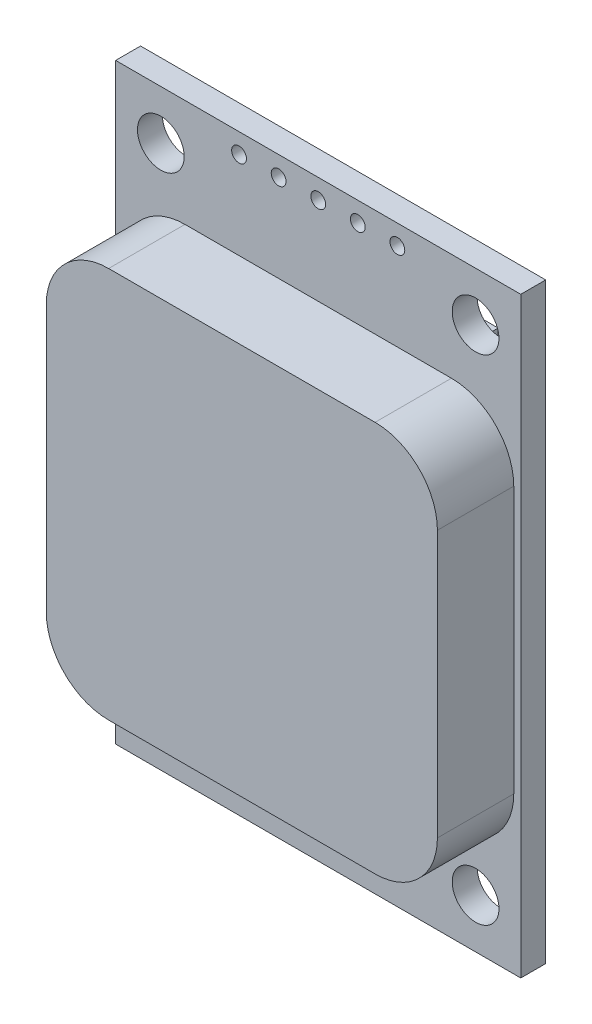
ISO-10303-21;
HEADER;
FILE_DESCRIPTION(('STEP AP214'),'2;1');
FILE_NAME('part.step','',(''),(''),'','','');
FILE_SCHEMA(('AUTOMOTIVE_DESIGN { 1 0 10303 214 1 1 1 1 }'));
ENDSEC;
DATA;
#1=APPLICATION_CONTEXT('core data for automotive mechanical design processes');
#2=APPLICATION_PROTOCOL_DEFINITION('international standard','automotive_design',2000,#1);
#3=PRODUCT_CONTEXT('',#1,'mechanical');
#4=PRODUCT('Part','Part','',(#3));
#5=PRODUCT_RELATED_PRODUCT_CATEGORY('part','',(#4));
#6=PRODUCT_DEFINITION_FORMATION('','',#4);
#7=PRODUCT_DEFINITION_CONTEXT('part definition',#1,'design');
#8=PRODUCT_DEFINITION('design','',#6,#7);
#9=PRODUCT_DEFINITION_SHAPE('','',#8);
#10=(LENGTH_UNIT() NAMED_UNIT(*) SI_UNIT(.MILLI.,.METRE.));
#11=(NAMED_UNIT(*) PLANE_ANGLE_UNIT() SI_UNIT($,.RADIAN.));
#12=(NAMED_UNIT(*) SI_UNIT($,.STERADIAN.) SOLID_ANGLE_UNIT());
#13=UNCERTAINTY_MEASURE_WITH_UNIT(LENGTH_MEASURE(1.E-05),#10,'distance_accuracy_value','');
#14=(GEOMETRIC_REPRESENTATION_CONTEXT(3) GLOBAL_UNCERTAINTY_ASSIGNED_CONTEXT((#13)) GLOBAL_UNIT_ASSIGNED_CONTEXT((#10,
#11,#12)) REPRESENTATION_CONTEXT('',''));
#15=CARTESIAN_POINT('',(0.,0.,0.));
#16=DIRECTION('',(0.,0.,1.));
#17=DIRECTION('',(1.,0.,0.));
#18=AXIS2_PLACEMENT_3D('',#15,#16,#17);
#19=CARTESIAN_POINT('',(0.,0.,-1.6));
#20=DIRECTION('',(0.,0.,1.));
#21=DIRECTION('',(1.,0.,0.));
#22=AXIS2_PLACEMENT_3D('',#19,#20,#21);
#23=PLANE('',#22);
#24=CARTESIAN_POINT('',(-5.08,17.73,-1.6));
#25=DIRECTION('',(0.,0.,-1.));
#26=DIRECTION('',(-1.,0.,0.));
#27=AXIS2_PLACEMENT_3D('',#24,#25,#26);
#28=CIRCLE('',#27,0.475);
#29=CARTESIAN_POINT('',(-5.555,17.73,-1.6));
#30=VERTEX_POINT('',#29);
#31=EDGE_CURVE('E454',#30,#30,#28,.T.);
#32=ORIENTED_EDGE('',*,*,#31,.F.);
#33=EDGE_LOOP('',(#32));
#34=FACE_BOUND('',#33,.T.);
#35=CARTESIAN_POINT('',(2.54,17.73,-1.6));
#36=DIRECTION('',(0.,0.,-1.));
#37=DIRECTION('',(-1.,0.,0.));
#38=AXIS2_PLACEMENT_3D('',#35,#36,#37);
#39=CIRCLE('',#38,0.475);
#40=CARTESIAN_POINT('',(2.065,17.73,-1.6));
#41=VERTEX_POINT('',#40);
#42=EDGE_CURVE('E455',#41,#41,#39,.T.);
#43=ORIENTED_EDGE('',*,*,#42,.F.);
#44=EDGE_LOOP('',(#43));
#45=FACE_BOUND('',#44,.T.);
#46=CARTESIAN_POINT('',(5.08,17.73,-1.6));
#47=DIRECTION('',(0.,0.,-1.));
#48=DIRECTION('',(-1.,0.,0.));
#49=AXIS2_PLACEMENT_3D('',#46,#47,#48);
#50=CIRCLE('',#49,0.475);
#51=CARTESIAN_POINT('',(4.605,17.73,-1.6));
#52=VERTEX_POINT('',#51);
#53=EDGE_CURVE('E462',#52,#52,#50,.T.);
#54=ORIENTED_EDGE('',*,*,#53,.F.);
#55=EDGE_LOOP('',(#54));
#56=FACE_BOUND('',#55,.T.);
#57=CARTESIAN_POINT('',(-2.54,17.73,-1.6));
#58=DIRECTION('',(0.,0.,-1.));
#59=DIRECTION('',(-1.,0.,0.));
#60=AXIS2_PLACEMENT_3D('',#57,#58,#59);
#61=CIRCLE('',#60,0.475);
#62=CARTESIAN_POINT('',(-3.015,17.73,-1.6));
#63=VERTEX_POINT('',#62);
#64=EDGE_CURVE('E447',#63,#63,#61,.T.);
#65=ORIENTED_EDGE('',*,*,#64,.F.);
#66=EDGE_LOOP('',(#65));
#67=FACE_BOUND('',#66,.T.);
#68=CARTESIAN_POINT('',(0.,17.73,-1.6));
#69=DIRECTION('',(0.,0.,-1.));
#70=DIRECTION('',(-1.,0.,0.));
#71=AXIS2_PLACEMENT_3D('',#68,#69,#70);
#72=CIRCLE('',#71,0.475);
#73=CARTESIAN_POINT('',(-0.475000000000002,17.73,-1.6));
#74=VERTEX_POINT('',#73);
#75=EDGE_CURVE('E428',#74,#74,#72,.T.);
#76=ORIENTED_EDGE('',*,*,#75,.F.);
#77=EDGE_LOOP('',(#76));
#78=FACE_BOUND('',#77,.T.);
#79=DIRECTION('',(0.,-1.,0.));
#80=VECTOR('',#79,1.);
#81=CARTESIAN_POINT('',(7.55,12.4,-1.6));
#82=LINE('',#81,#80);
#83=CARTESIAN_POINT('',(7.55,12.4,-1.6));
#84=VERTEX_POINT('',#83);
#85=CARTESIAN_POINT('',(7.55,0.700000000000004,-1.6));
#86=VERTEX_POINT('',#85);
#87=EDGE_CURVE('E194',#84,#86,#82,.T.);
#88=ORIENTED_EDGE('',*,*,#87,.F.);
#89=DIRECTION('',(1.,0.,0.));
#90=VECTOR('',#89,1.);
#91=CARTESIAN_POINT('',(7.55,12.4,-1.6));
#92=LINE('',#91,#90);
#93=CARTESIAN_POINT('',(-7.55,12.4,-1.6));
#94=VERTEX_POINT('',#93);
#95=EDGE_CURVE('E206',#94,#84,#92,.T.);
#96=ORIENTED_EDGE('',*,*,#95,.F.);
#97=DIRECTION('',(0.,1.,0.));
#98=VECTOR('',#97,1.);
#99=CARTESIAN_POINT('',(-7.55,12.4,-1.6));
#100=LINE('',#99,#98);
#101=CARTESIAN_POINT('',(-7.55,0.700000000000006,-1.6));
#102=VERTEX_POINT('',#101);
#103=EDGE_CURVE('E214',#102,#94,#100,.T.);
#104=ORIENTED_EDGE('',*,*,#103,.F.);
#105=DIRECTION('',(-1.,0.,0.));
#106=VECTOR('',#105,1.);
#107=CARTESIAN_POINT('',(7.55,0.700000000000004,-1.6));
#108=LINE('',#107,#106);
#109=EDGE_CURVE('E59',#86,#102,#108,.T.);
#110=ORIENTED_EDGE('',*,*,#109,.F.);
#111=EDGE_LOOP('',(#88,#96,#104,#110));
#112=FACE_BOUND('',#111,.T.);
#113=CARTESIAN_POINT('',(-10.1,-15.85,-1.6));
#114=DIRECTION('',(0.,0.,1.));
#115=DIRECTION('',(1.,0.,0.));
#116=AXIS2_PLACEMENT_3D('',#113,#114,#115);
#117=CIRCLE('',#116,1.5);
#118=CARTESIAN_POINT('',(-8.59999999999999,-15.85,-1.6));
#119=VERTEX_POINT('',#118);
#120=EDGE_CURVE('E265',#119,#119,#117,.F.);
#121=ORIENTED_EDGE('',*,*,#120,.F.);
#122=EDGE_LOOP('',(#121));
#123=FACE_BOUND('',#122,.T.);
#124=CARTESIAN_POINT('',(10.1,-15.85,-1.6));
#125=DIRECTION('',(0.,0.,1.));
#126=DIRECTION('',(1.,0.,0.));
#127=AXIS2_PLACEMENT_3D('',#124,#125,#126);
#128=CIRCLE('',#127,1.5);
#129=CARTESIAN_POINT('',(11.6,-15.85,-1.6));
#130=VERTEX_POINT('',#129);
#131=EDGE_CURVE('E258',#130,#130,#128,.F.);
#132=ORIENTED_EDGE('',*,*,#131,.F.);
#133=EDGE_LOOP('',(#132));
#134=FACE_BOUND('',#133,.T.);
#135=CARTESIAN_POINT('',(10.1,15.85,-1.6));
#136=DIRECTION('',(0.,0.,1.));
#137=DIRECTION('',(1.,0.,0.));
#138=AXIS2_PLACEMENT_3D('',#135,#136,#137);
#139=CIRCLE('',#138,1.5);
#140=CARTESIAN_POINT('',(11.6,15.85,-1.6));
#141=VERTEX_POINT('',#140);
#142=EDGE_CURVE('E257',#141,#141,#139,.F.);
#143=ORIENTED_EDGE('',*,*,#142,.F.);
#144=EDGE_LOOP('',(#143));
#145=FACE_BOUND('',#144,.T.);
#146=CARTESIAN_POINT('',(-10.1,15.85,-1.6));
#147=DIRECTION('',(0.,0.,1.));
#148=DIRECTION('',(1.,0.,0.));
#149=AXIS2_PLACEMENT_3D('',#146,#147,#148);
#150=CIRCLE('',#149,1.5);
#151=CARTESIAN_POINT('',(-8.59999999999999,15.85,-1.6));
#152=VERTEX_POINT('',#151);
#153=EDGE_CURVE('E274',#152,#152,#150,.F.);
#154=ORIENTED_EDGE('',*,*,#153,.F.);
#155=EDGE_LOOP('',(#154));
#156=FACE_BOUND('',#155,.T.);
#157=DIRECTION('',(0.,-1.,0.));
#158=VECTOR('',#157,1.);
#159=CARTESIAN_POINT('',(3.95000000000001,-13.3,-1.6));
#160=LINE('',#159,#158);
#161=CARTESIAN_POINT('',(3.95000000000001,-13.3,-1.6));
#162=VERTEX_POINT('',#161);
#163=CARTESIAN_POINT('',(3.95,-19.,-1.6));
#164=VERTEX_POINT('',#163);
#165=EDGE_CURVE('E51',#162,#164,#160,.T.);
#166=ORIENTED_EDGE('',*,*,#165,.F.);
#167=DIRECTION('',(1.,0.,0.));
#168=VECTOR('',#167,1.);
#169=CARTESIAN_POINT('',(3.95000000000001,-13.3,-1.6));
#170=LINE('',#169,#168);
#171=CARTESIAN_POINT('',(-3.94999999999999,-13.3,-1.6));
#172=VERTEX_POINT('',#171);
#173=EDGE_CURVE('E191',#172,#162,#170,.T.);
#174=ORIENTED_EDGE('',*,*,#173,.F.);
#175=DIRECTION('',(0.,1.,0.));
#176=VECTOR('',#175,1.);
#177=CARTESIAN_POINT('',(-3.94999999999999,-13.3,-1.6));
#178=LINE('',#177,#176);
#179=CARTESIAN_POINT('',(-3.95000000000002,-19.,-1.6));
#180=VERTEX_POINT('',#179);
#181=EDGE_CURVE('E426',#180,#172,#178,.T.);
#182=ORIENTED_EDGE('',*,*,#181,.F.);
#183=DIRECTION('',(1.,0.,0.));
#184=VECTOR('',#183,1.);
#185=CARTESIAN_POINT('',(-13.,-19.,-1.6));
#186=LINE('',#185,#184);
#187=CARTESIAN_POINT('',(-13.,-19.,-1.6));
#188=VERTEX_POINT('',#187);
#189=EDGE_CURVE('E283',#188,#180,#186,.T.);
#190=ORIENTED_EDGE('',*,*,#189,.F.);
#191=DIRECTION('',(0.,-1.,0.));
#192=VECTOR('',#191,1.);
#193=CARTESIAN_POINT('',(-13.,19.,-1.6));
#194=LINE('',#193,#192);
#195=CARTESIAN_POINT('',(-13.,19.,-1.6));
#196=VERTEX_POINT('',#195);
#197=EDGE_CURVE('E278',#196,#188,#194,.T.);
#198=ORIENTED_EDGE('',*,*,#197,.F.);
#199=DIRECTION('',(-1.,0.,0.));
#200=VECTOR('',#199,1.);
#201=CARTESIAN_POINT('',(-13.,19.,-1.6));
#202=LINE('',#201,#200);
#203=CARTESIAN_POINT('',(13.,19.,-1.6));
#204=VERTEX_POINT('',#203);
#205=EDGE_CURVE('E288',#204,#196,#202,.T.);
#206=ORIENTED_EDGE('',*,*,#205,.F.);
#207=DIRECTION('',(0.,1.,0.));
#208=VECTOR('',#207,1.);
#209=CARTESIAN_POINT('',(13.,19.,-1.6));
#210=LINE('',#209,#208);
#211=CARTESIAN_POINT('',(13.,-19.,-1.6));
#212=VERTEX_POINT('',#211);
#213=EDGE_CURVE('E285',#212,#204,#210,.T.);
#214=ORIENTED_EDGE('',*,*,#213,.F.);
#215=EDGE_CURVE('E281',#164,#212,#186,.T.);
#216=ORIENTED_EDGE('',*,*,#215,.F.);
#217=EDGE_LOOP('',(#166,#174,#182,#190,#198,#206,#214,#216));
#218=FACE_BOUND('',#217,.T.);
#219=ADVANCED_FACE('F36',(#34,#45,#56,#67,#78,#112,#123,#134,#145,#156,#218),#23,.F.);
#220=CARTESIAN_POINT('',(0.,0.,0.));
#221=DIRECTION('',(0.,0.,1.));
#222=DIRECTION('',(1.,0.,0.));
#223=AXIS2_PLACEMENT_3D('',#220,#221,#222);
#224=PLANE('',#223);
#225=CARTESIAN_POINT('',(-5.08,17.73,0.));
#226=DIRECTION('',(0.,0.,1.));
#227=DIRECTION('',(1.,0.,0.));
#228=AXIS2_PLACEMENT_3D('',#225,#226,#227);
#229=CIRCLE('',#228,0.475);
#230=CARTESIAN_POINT('',(-4.605,17.73,0.));
#231=VERTEX_POINT('',#230);
#232=EDGE_CURVE('E458',#231,#231,#229,.F.);
#233=ORIENTED_EDGE('',*,*,#232,.T.);
#234=EDGE_LOOP('',(#233));
#235=FACE_BOUND('',#234,.T.);
#236=CARTESIAN_POINT('',(2.54,17.73,0.));
#237=DIRECTION('',(0.,0.,1.));
#238=DIRECTION('',(1.,0.,0.));
#239=AXIS2_PLACEMENT_3D('',#236,#237,#238);
#240=CIRCLE('',#239,0.475);
#241=CARTESIAN_POINT('',(3.015,17.73,0.));
#242=VERTEX_POINT('',#241);
#243=EDGE_CURVE('E459',#242,#242,#240,.F.);
#244=ORIENTED_EDGE('',*,*,#243,.T.);
#245=EDGE_LOOP('',(#244));
#246=FACE_BOUND('',#245,.T.);
#247=CARTESIAN_POINT('',(5.08,17.73,0.));
#248=DIRECTION('',(0.,0.,1.));
#249=DIRECTION('',(1.,0.,0.));
#250=AXIS2_PLACEMENT_3D('',#247,#248,#249);
#251=CIRCLE('',#250,0.475);
#252=CARTESIAN_POINT('',(5.555,17.73,0.));
#253=VERTEX_POINT('',#252);
#254=EDGE_CURVE('E469',#253,#253,#251,.F.);
#255=ORIENTED_EDGE('',*,*,#254,.T.);
#256=EDGE_LOOP('',(#255));
#257=FACE_BOUND('',#256,.T.);
#258=CARTESIAN_POINT('',(-2.54,17.73,0.));
#259=DIRECTION('',(0.,0.,1.));
#260=DIRECTION('',(1.,0.,0.));
#261=AXIS2_PLACEMENT_3D('',#258,#259,#260);
#262=CIRCLE('',#261,0.475);
#263=CARTESIAN_POINT('',(-2.065,17.73,0.));
#264=VERTEX_POINT('',#263);
#265=EDGE_CURVE('E451',#264,#264,#262,.F.);
#266=ORIENTED_EDGE('',*,*,#265,.T.);
#267=EDGE_LOOP('',(#266));
#268=FACE_BOUND('',#267,.T.);
#269=CARTESIAN_POINT('',(0.,17.73,0.));
#270=DIRECTION('',(0.,0.,1.));
#271=DIRECTION('',(1.,0.,0.));
#272=AXIS2_PLACEMENT_3D('',#269,#270,#271);
#273=CIRCLE('',#272,0.475);
#274=CARTESIAN_POINT('',(0.474999999999998,17.73,0.));
#275=VERTEX_POINT('',#274);
#276=EDGE_CURVE('E432',#275,#275,#273,.F.);
#277=ORIENTED_EDGE('',*,*,#276,.T.);
#278=EDGE_LOOP('',(#277));
#279=FACE_BOUND('',#278,.T.);
#280=CARTESIAN_POINT('',(-10.1,-15.85,0.));
#281=DIRECTION('',(0.,0.,1.));
#282=DIRECTION('',(1.,0.,0.));
#283=AXIS2_PLACEMENT_3D('',#280,#281,#282);
#284=CIRCLE('',#283,1.5);
#285=CARTESIAN_POINT('',(-8.59999999999999,-15.85,0.));
#286=VERTEX_POINT('',#285);
#287=EDGE_CURVE('E243',#286,#286,#284,.T.);
#288=ORIENTED_EDGE('',*,*,#287,.F.);
#289=EDGE_LOOP('',(#288));
#290=FACE_BOUND('',#289,.T.);
#291=CARTESIAN_POINT('',(10.1,-15.85,0.));
#292=DIRECTION('',(0.,0.,1.));
#293=DIRECTION('',(1.,0.,0.));
#294=AXIS2_PLACEMENT_3D('',#291,#292,#293);
#295=CIRCLE('',#294,1.5);
#296=CARTESIAN_POINT('',(11.6,-15.85,0.));
#297=VERTEX_POINT('',#296);
#298=EDGE_CURVE('E262',#297,#297,#295,.T.);
#299=ORIENTED_EDGE('',*,*,#298,.F.);
#300=EDGE_LOOP('',(#299));
#301=FACE_BOUND('',#300,.T.);
#302=CARTESIAN_POINT('',(10.1,15.85,0.));
#303=DIRECTION('',(0.,0.,1.));
#304=DIRECTION('',(1.,0.,0.));
#305=AXIS2_PLACEMENT_3D('',#302,#303,#304);
#306=CIRCLE('',#305,1.5);
#307=CARTESIAN_POINT('',(11.6,15.85,0.));
#308=VERTEX_POINT('',#307);
#309=EDGE_CURVE('E254',#308,#308,#306,.T.);
#310=ORIENTED_EDGE('',*,*,#309,.F.);
#311=EDGE_LOOP('',(#310));
#312=FACE_BOUND('',#311,.T.);
#313=CARTESIAN_POINT('',(-10.1,15.85,0.));
#314=DIRECTION('',(0.,0.,1.));
#315=DIRECTION('',(1.,0.,0.));
#316=AXIS2_PLACEMENT_3D('',#313,#314,#315);
#317=CIRCLE('',#316,1.5);
#318=CARTESIAN_POINT('',(-8.59999999999999,15.85,0.));
#319=VERTEX_POINT('',#318);
#320=EDGE_CURVE('E261',#319,#319,#317,.T.);
#321=ORIENTED_EDGE('',*,*,#320,.F.);
#322=EDGE_LOOP('',(#321));
#323=FACE_BOUND('',#322,.T.);
#324=DIRECTION('',(0.,-1.,0.));
#325=VECTOR('',#324,1.);
#326=CARTESIAN_POINT('',(-13.,19.,0.));
#327=LINE('',#326,#325);
#328=CARTESIAN_POINT('',(-13.,19.,0.));
#329=VERTEX_POINT('',#328);
#330=CARTESIAN_POINT('',(-13.,-19.,0.));
#331=VERTEX_POINT('',#330);
#332=EDGE_CURVE('E277',#329,#331,#327,.T.);
#333=ORIENTED_EDGE('',*,*,#332,.T.);
#334=DIRECTION('',(1.,0.,0.));
#335=VECTOR('',#334,1.);
#336=CARTESIAN_POINT('',(-13.,-19.,0.));
#337=LINE('',#336,#335);
#338=CARTESIAN_POINT('',(13.,-19.,0.));
#339=VERTEX_POINT('',#338);
#340=EDGE_CURVE('E294',#331,#339,#337,.T.);
#341=ORIENTED_EDGE('',*,*,#340,.T.);
#342=DIRECTION('',(0.,1.,0.));
#343=VECTOR('',#342,1.);
#344=CARTESIAN_POINT('',(13.,19.,0.));
#345=LINE('',#344,#343);
#346=CARTESIAN_POINT('',(13.,19.,0.));
#347=VERTEX_POINT('',#346);
#348=EDGE_CURVE('E297',#339,#347,#345,.T.);
#349=ORIENTED_EDGE('',*,*,#348,.T.);
#350=DIRECTION('',(-1.,0.,0.));
#351=VECTOR('',#350,1.);
#352=CARTESIAN_POINT('',(-13.,19.,0.));
#353=LINE('',#352,#351);
#354=EDGE_CURVE('E282',#347,#329,#353,.T.);
#355=ORIENTED_EDGE('',*,*,#354,.T.);
#356=EDGE_LOOP('',(#333,#341,#349,#355));
#357=FACE_BOUND('',#356,.T.);
#358=DIRECTION('',(1.,0.,0.));
#359=VECTOR('',#358,1.);
#360=CARTESIAN_POINT('',(-12.55,-12.99,0.));
#361=LINE('',#360,#359);
#362=CARTESIAN_POINT('',(-8.55,-12.99,0.));
#363=VERTEX_POINT('',#362);
#364=CARTESIAN_POINT('',(8.55,-12.99,0.));
#365=VERTEX_POINT('',#364);
#366=EDGE_CURVE('E246',#363,#365,#361,.T.);
#367=ORIENTED_EDGE('',*,*,#366,.F.);
#368=CARTESIAN_POINT('',(-8.55,-8.98999999999999,0.));
#369=DIRECTION('',(0.,0.,1.));
#370=DIRECTION('',(1.,0.,0.));
#371=AXIS2_PLACEMENT_3D('',#368,#369,#370);
#372=CIRCLE('',#371,4.);
#373=CARTESIAN_POINT('',(-12.55,-8.98999999999998,0.));
#374=VERTEX_POINT('',#373);
#375=EDGE_CURVE('E339',#363,#374,#372,.F.);
#376=ORIENTED_EDGE('',*,*,#375,.T.);
#377=DIRECTION('',(0.,-1.,0.));
#378=VECTOR('',#377,1.);
#379=CARTESIAN_POINT('',(-12.55,12.11,0.));
#380=LINE('',#379,#378);
#381=CARTESIAN_POINT('',(-12.55,8.11,0.));
#382=VERTEX_POINT('',#381);
#383=EDGE_CURVE('E229',#382,#374,#380,.T.);
#384=ORIENTED_EDGE('',*,*,#383,.F.);
#385=CARTESIAN_POINT('',(-8.55,8.11,0.));
#386=DIRECTION('',(0.,0.,1.));
#387=DIRECTION('',(1.,0.,0.));
#388=AXIS2_PLACEMENT_3D('',#385,#386,#387);
#389=CIRCLE('',#388,4.);
#390=CARTESIAN_POINT('',(-8.55,12.11,0.));
#391=VERTEX_POINT('',#390);
#392=EDGE_CURVE('E337',#382,#391,#389,.F.);
#393=ORIENTED_EDGE('',*,*,#392,.T.);
#394=DIRECTION('',(-1.,0.,0.));
#395=VECTOR('',#394,1.);
#396=CARTESIAN_POINT('',(-12.55,12.11,0.));
#397=LINE('',#396,#395);
#398=CARTESIAN_POINT('',(8.55,12.11,0.));
#399=VERTEX_POINT('',#398);
#400=EDGE_CURVE('E234',#399,#391,#397,.T.);
#401=ORIENTED_EDGE('',*,*,#400,.F.);
#402=CARTESIAN_POINT('',(8.55,8.11000000000001,0.));
#403=DIRECTION('',(0.,0.,1.));
#404=DIRECTION('',(1.,0.,0.));
#405=AXIS2_PLACEMENT_3D('',#402,#403,#404);
#406=CIRCLE('',#405,4.);
#407=CARTESIAN_POINT('',(12.55,8.11000000000001,0.));
#408=VERTEX_POINT('',#407);
#409=EDGE_CURVE('E11',#399,#408,#406,.F.);
#410=ORIENTED_EDGE('',*,*,#409,.T.);
#411=DIRECTION('',(0.,1.,0.));
#412=VECTOR('',#411,1.);
#413=CARTESIAN_POINT('',(12.55,12.11,0.));
#414=LINE('',#413,#412);
#415=CARTESIAN_POINT('',(12.55,-8.98999999999999,0.));
#416=VERTEX_POINT('',#415);
#417=EDGE_CURVE('E249',#416,#408,#414,.T.);
#418=ORIENTED_EDGE('',*,*,#417,.F.);
#419=CARTESIAN_POINT('',(8.55,-8.98999999999999,0.));
#420=DIRECTION('',(0.,0.,1.));
#421=DIRECTION('',(1.,0.,0.));
#422=AXIS2_PLACEMENT_3D('',#419,#420,#421);
#423=CIRCLE('',#422,4.);
#424=EDGE_CURVE('E44',#416,#365,#423,.F.);
#425=ORIENTED_EDGE('',*,*,#424,.T.);
#426=EDGE_LOOP('',(#367,#376,#384,#393,#401,#410,#418,#425));
#427=FACE_BOUND('',#426,.T.);
#428=ADVANCED_FACE('F343',(#235,#246,#257,#268,#279,#290,#301,#312,#323,#357,#427),#224,.T.);
#429=CARTESIAN_POINT('',(-13.,19.,-1.6));
#430=DIRECTION('',(-1.,0.,0.));
#431=DIRECTION('',(0.,-1.,0.));
#432=AXIS2_PLACEMENT_3D('',#429,#430,#431);
#433=PLANE('',#432);
#434=ORIENTED_EDGE('',*,*,#332,.F.);
#435=DIRECTION('',(0.,0.,1.));
#436=VECTOR('',#435,1.);
#437=CARTESIAN_POINT('',(-13.,19.,-1.6));
#438=LINE('',#437,#436);
#439=EDGE_CURVE('E302',#196,#329,#438,.T.);
#440=ORIENTED_EDGE('',*,*,#439,.F.);
#441=ORIENTED_EDGE('',*,*,#197,.T.);
#442=DIRECTION('',(0.,0.,1.));
#443=VECTOR('',#442,1.);
#444=CARTESIAN_POINT('',(-13.,-19.,-1.6));
#445=LINE('',#444,#443);
#446=EDGE_CURVE('E291',#188,#331,#445,.T.);
#447=ORIENTED_EDGE('',*,*,#446,.T.);
#448=EDGE_LOOP('',(#434,#440,#441,#447));
#449=FACE_BOUND('',#448,.T.);
#450=ADVANCED_FACE('F392',(#449),#433,.T.);
#451=CARTESIAN_POINT('',(-13.,19.,-1.6));
#452=DIRECTION('',(0.,1.,0.));
#453=DIRECTION('',(-1.,0.,0.));
#454=AXIS2_PLACEMENT_3D('',#451,#452,#453);
#455=PLANE('',#454);
#456=ORIENTED_EDGE('',*,*,#354,.F.);
#457=DIRECTION('',(0.,0.,1.));
#458=VECTOR('',#457,1.);
#459=CARTESIAN_POINT('',(13.,19.,-1.6));
#460=LINE('',#459,#458);
#461=EDGE_CURVE('E305',#204,#347,#460,.T.);
#462=ORIENTED_EDGE('',*,*,#461,.F.);
#463=ORIENTED_EDGE('',*,*,#205,.T.);
#464=ORIENTED_EDGE('',*,*,#439,.T.);
#465=EDGE_LOOP('',(#456,#462,#463,#464));
#466=FACE_BOUND('',#465,.T.);
#467=ADVANCED_FACE('F401',(#466),#455,.T.);
#468=CARTESIAN_POINT('',(13.,19.,-1.6));
#469=DIRECTION('',(1.,0.,0.));
#470=DIRECTION('',(0.,1.,0.));
#471=AXIS2_PLACEMENT_3D('',#468,#469,#470);
#472=PLANE('',#471);
#473=ORIENTED_EDGE('',*,*,#348,.F.);
#474=DIRECTION('',(0.,0.,1.));
#475=VECTOR('',#474,1.);
#476=CARTESIAN_POINT('',(13.,-19.,-1.6));
#477=LINE('',#476,#475);
#478=EDGE_CURVE('E307',#212,#339,#477,.T.);
#479=ORIENTED_EDGE('',*,*,#478,.F.);
#480=ORIENTED_EDGE('',*,*,#213,.T.);
#481=ORIENTED_EDGE('',*,*,#461,.T.);
#482=EDGE_LOOP('',(#473,#479,#480,#481));
#483=FACE_BOUND('',#482,.T.);
#484=ADVANCED_FACE('F404',(#483),#472,.T.);
#485=CARTESIAN_POINT('',(-13.,-19.,-1.6));
#486=DIRECTION('',(0.,-1.,0.));
#487=DIRECTION('',(1.,0.,0.));
#488=AXIS2_PLACEMENT_3D('',#485,#486,#487);
#489=PLANE('',#488);
#490=ORIENTED_EDGE('',*,*,#340,.F.);
#491=ORIENTED_EDGE('',*,*,#446,.F.);
#492=ORIENTED_EDGE('',*,*,#189,.T.);
#493=DIRECTION('',(0.,0.,1.));
#494=VECTOR('',#493,1.);
#495=CARTESIAN_POINT('',(-3.95000000000002,-19.,-4.4));
#496=LINE('',#495,#494);
#497=CARTESIAN_POINT('',(-3.95000000000002,-19.,-4.4));
#498=VERTEX_POINT('',#497);
#499=EDGE_CURVE('E180',#498,#180,#496,.T.);
#500=ORIENTED_EDGE('',*,*,#499,.F.);
#501=DIRECTION('',(-1.,0.,0.));
#502=VECTOR('',#501,1.);
#503=CARTESIAN_POINT('',(3.95000000000001,-19.,-4.4));
#504=LINE('',#503,#502);
#505=CARTESIAN_POINT('',(3.95000000000001,-19.,-4.4));
#506=VERTEX_POINT('',#505);
#507=EDGE_CURVE('E173',#506,#498,#504,.T.);
#508=ORIENTED_EDGE('',*,*,#507,.F.);
#509=DIRECTION('',(0.,0.,1.));
#510=VECTOR('',#509,1.);
#511=CARTESIAN_POINT('',(3.95000000000001,-19.,-4.4));
#512=LINE('',#511,#510);
#513=EDGE_CURVE('E177',#506,#164,#512,.T.);
#514=ORIENTED_EDGE('',*,*,#513,.T.);
#515=ORIENTED_EDGE('',*,*,#215,.T.);
#516=ORIENTED_EDGE('',*,*,#478,.T.);
#517=EDGE_LOOP('',(#490,#491,#492,#500,#508,#514,#515,#516));
#518=FACE_BOUND('',#517,.T.);
#519=ADVANCED_FACE('F176',(#518),#489,.T.);
#520=CARTESIAN_POINT('',(-10.1,15.85,-1.601));
#521=DIRECTION('',(0.,0.,1.));
#522=DIRECTION('',(1.,0.,0.));
#523=AXIS2_PLACEMENT_3D('',#520,#521,#522);
#524=CYLINDRICAL_SURFACE('',#523,1.5);
#525=ORIENTED_EDGE('',*,*,#320,.T.);
#526=EDGE_LOOP('',(#525));
#527=FACE_BOUND('',#526,.T.);
#528=ORIENTED_EDGE('',*,*,#153,.T.);
#529=EDGE_LOOP('',(#528));
#530=FACE_BOUND('',#529,.T.);
#531=ADVANCED_FACE('F398',(#527,#530),#524,.F.);
#532=CARTESIAN_POINT('',(10.1,15.85,-1.601));
#533=DIRECTION('',(0.,0.,1.));
#534=DIRECTION('',(1.,0.,0.));
#535=AXIS2_PLACEMENT_3D('',#532,#533,#534);
#536=CYLINDRICAL_SURFACE('',#535,1.5);
#537=ORIENTED_EDGE('',*,*,#309,.T.);
#538=EDGE_LOOP('',(#537));
#539=FACE_BOUND('',#538,.T.);
#540=ORIENTED_EDGE('',*,*,#142,.T.);
#541=EDGE_LOOP('',(#540));
#542=FACE_BOUND('',#541,.T.);
#543=ADVANCED_FACE('F497',(#539,#542),#536,.F.);
#544=CARTESIAN_POINT('',(10.1,-15.85,-1.601));
#545=DIRECTION('',(0.,0.,1.));
#546=DIRECTION('',(1.,0.,0.));
#547=AXIS2_PLACEMENT_3D('',#544,#545,#546);
#548=CYLINDRICAL_SURFACE('',#547,1.5);
#549=ORIENTED_EDGE('',*,*,#298,.T.);
#550=EDGE_LOOP('',(#549));
#551=FACE_BOUND('',#550,.T.);
#552=ORIENTED_EDGE('',*,*,#131,.T.);
#553=EDGE_LOOP('',(#552));
#554=FACE_BOUND('',#553,.T.);
#555=ADVANCED_FACE('F502',(#551,#554),#548,.F.);
#556=CARTESIAN_POINT('',(-10.1,-15.85,-1.601));
#557=DIRECTION('',(0.,0.,1.));
#558=DIRECTION('',(1.,0.,0.));
#559=AXIS2_PLACEMENT_3D('',#556,#557,#558);
#560=CYLINDRICAL_SURFACE('',#559,1.5);
#561=ORIENTED_EDGE('',*,*,#287,.T.);
#562=EDGE_LOOP('',(#561));
#563=FACE_BOUND('',#562,.T.);
#564=ORIENTED_EDGE('',*,*,#120,.T.);
#565=EDGE_LOOP('',(#564));
#566=FACE_BOUND('',#565,.T.);
#567=ADVANCED_FACE('F510',(#563,#566),#560,.F.);
#568=CARTESIAN_POINT('',(-12.55,12.11,4.9));
#569=DIRECTION('',(1.,0.,0.));
#570=DIRECTION('',(0.,1.,0.));
#571=AXIS2_PLACEMENT_3D('',#568,#569,#570);
#572=PLANE('',#571);
#573=DIRECTION('',(0.,-1.,0.));
#574=VECTOR('',#573,1.);
#575=CARTESIAN_POINT('',(-12.55,12.11,4.9));
#576=LINE('',#575,#574);
#577=CARTESIAN_POINT('',(-12.55,8.11,4.9));
#578=VERTEX_POINT('',#577);
#579=CARTESIAN_POINT('',(-12.55,-8.98999999999998,4.9));
#580=VERTEX_POINT('',#579);
#581=EDGE_CURVE('E230',#578,#580,#576,.T.);
#582=ORIENTED_EDGE('',*,*,#581,.F.);
#583=DIRECTION('',(0.,0.,-1.));
#584=VECTOR('',#583,1.);
#585=CARTESIAN_POINT('',(-12.55,8.11,4.9));
#586=LINE('',#585,#584);
#587=EDGE_CURVE('E311',#578,#382,#586,.T.);
#588=ORIENTED_EDGE('',*,*,#587,.T.);
#589=ORIENTED_EDGE('',*,*,#383,.T.);
#590=DIRECTION('',(0.,0.,-1.));
#591=VECTOR('',#590,1.);
#592=CARTESIAN_POINT('',(-12.55,-8.98999999999999,4.9));
#593=LINE('',#592,#591);
#594=EDGE_CURVE('E304',#374,#580,#593,.F.);
#595=ORIENTED_EDGE('',*,*,#594,.T.);
#596=EDGE_LOOP('',(#582,#588,#589,#595));
#597=FACE_BOUND('',#596,.T.);
#598=ADVANCED_FACE('F374',(#597),#572,.F.);
#599=CARTESIAN_POINT('',(-12.55,-12.99,4.9));
#600=DIRECTION('',(0.,1.,0.));
#601=DIRECTION('',(-1.,0.,0.));
#602=AXIS2_PLACEMENT_3D('',#599,#600,#601);
#603=PLANE('',#602);
#604=DIRECTION('',(1.,0.,0.));
#605=VECTOR('',#604,1.);
#606=CARTESIAN_POINT('',(-12.55,-12.99,4.9));
#607=LINE('',#606,#605);
#608=CARTESIAN_POINT('',(-8.55,-12.99,4.9));
#609=VERTEX_POINT('',#608);
#610=CARTESIAN_POINT('',(8.55,-12.99,4.9));
#611=VERTEX_POINT('',#610);
#612=EDGE_CURVE('E233',#609,#611,#607,.T.);
#613=ORIENTED_EDGE('',*,*,#612,.F.);
#614=DIRECTION('',(0.,0.,-1.));
#615=VECTOR('',#614,1.);
#616=CARTESIAN_POINT('',(-8.55,-12.99,4.9));
#617=LINE('',#616,#615);
#618=EDGE_CURVE('E329',#609,#363,#617,.T.);
#619=ORIENTED_EDGE('',*,*,#618,.T.);
#620=ORIENTED_EDGE('',*,*,#366,.T.);
#621=DIRECTION('',(0.,0.,-1.));
#622=VECTOR('',#621,1.);
#623=CARTESIAN_POINT('',(8.55,-12.99,4.9));
#624=LINE('',#623,#622);
#625=EDGE_CURVE('E327',#365,#611,#624,.F.);
#626=ORIENTED_EDGE('',*,*,#625,.T.);
#627=EDGE_LOOP('',(#613,#619,#620,#626));
#628=FACE_BOUND('',#627,.T.);
#629=ADVANCED_FACE('F349',(#628),#603,.F.);
#630=CARTESIAN_POINT('',(12.55,12.11,4.9));
#631=DIRECTION('',(-1.,0.,0.));
#632=DIRECTION('',(0.,-1.,0.));
#633=AXIS2_PLACEMENT_3D('',#630,#631,#632);
#634=PLANE('',#633);
#635=DIRECTION('',(0.,1.,0.));
#636=VECTOR('',#635,1.);
#637=CARTESIAN_POINT('',(12.55,12.11,4.9));
#638=LINE('',#637,#636);
#639=CARTESIAN_POINT('',(12.55,-8.98999999999999,4.9));
#640=VERTEX_POINT('',#639);
#641=CARTESIAN_POINT('',(12.55,8.11000000000001,4.9));
#642=VERTEX_POINT('',#641);
#643=EDGE_CURVE('E237',#640,#642,#638,.T.);
#644=ORIENTED_EDGE('',*,*,#643,.F.);
#645=DIRECTION('',(0.,0.,-1.));
#646=VECTOR('',#645,1.);
#647=CARTESIAN_POINT('',(12.55,-8.98999999999999,4.9));
#648=LINE('',#647,#646);
#649=EDGE_CURVE('E334',#640,#416,#648,.T.);
#650=ORIENTED_EDGE('',*,*,#649,.T.);
#651=ORIENTED_EDGE('',*,*,#417,.T.);
#652=DIRECTION('',(0.,0.,-1.));
#653=VECTOR('',#652,1.);
#654=CARTESIAN_POINT('',(12.55,8.11000000000001,4.9));
#655=LINE('',#654,#653);
#656=EDGE_CURVE('E332',#408,#642,#655,.F.);
#657=ORIENTED_EDGE('',*,*,#656,.T.);
#658=EDGE_LOOP('',(#644,#650,#651,#657));
#659=FACE_BOUND('',#658,.T.);
#660=ADVANCED_FACE('F358',(#659),#634,.F.);
#661=CARTESIAN_POINT('',(-12.55,12.11,4.9));
#662=DIRECTION('',(0.,-1.,0.));
#663=DIRECTION('',(1.,0.,0.));
#664=AXIS2_PLACEMENT_3D('',#661,#662,#663);
#665=PLANE('',#664);
#666=ORIENTED_EDGE('',*,*,#400,.T.);
#667=DIRECTION('',(0.,0.,-1.));
#668=VECTOR('',#667,1.);
#669=CARTESIAN_POINT('',(-8.55,12.11,4.9));
#670=LINE('',#669,#668);
#671=CARTESIAN_POINT('',(-8.55,12.11,4.9));
#672=VERTEX_POINT('',#671);
#673=EDGE_CURVE('E317',#391,#672,#670,.F.);
#674=ORIENTED_EDGE('',*,*,#673,.T.);
#675=DIRECTION('',(-1.,0.,0.));
#676=VECTOR('',#675,1.);
#677=CARTESIAN_POINT('',(-12.55,12.11,4.9));
#678=LINE('',#677,#676);
#679=CARTESIAN_POINT('',(8.55,12.11,4.9));
#680=VERTEX_POINT('',#679);
#681=EDGE_CURVE('E240',#680,#672,#678,.T.);
#682=ORIENTED_EDGE('',*,*,#681,.F.);
#683=DIRECTION('',(0.,0.,-1.));
#684=VECTOR('',#683,1.);
#685=CARTESIAN_POINT('',(8.55,12.11,4.9));
#686=LINE('',#685,#684);
#687=EDGE_CURVE('E314',#680,#399,#686,.T.);
#688=ORIENTED_EDGE('',*,*,#687,.T.);
#689=EDGE_LOOP('',(#666,#674,#682,#688));
#690=FACE_BOUND('',#689,.T.);
#691=ADVANCED_FACE('F365',(#690),#665,.F.);
#692=CARTESIAN_POINT('',(0.,0.,4.9));
#693=DIRECTION('',(0.,0.,1.));
#694=DIRECTION('',(1.,0.,0.));
#695=AXIS2_PLACEMENT_3D('',#692,#693,#694);
#696=PLANE('',#695);
#697=ORIENTED_EDGE('',*,*,#681,.T.);
#698=CARTESIAN_POINT('',(-8.55,8.11,4.9));
#699=DIRECTION('',(0.,0.,1.));
#700=DIRECTION('',(1.,0.,0.));
#701=AXIS2_PLACEMENT_3D('',#698,#699,#700);
#702=CIRCLE('',#701,4.);
#703=EDGE_CURVE('E325',#672,#578,#702,.T.);
#704=ORIENTED_EDGE('',*,*,#703,.T.);
#705=ORIENTED_EDGE('',*,*,#581,.T.);
#706=CARTESIAN_POINT('',(-8.55,-8.98999999999999,4.9));
#707=DIRECTION('',(0.,0.,1.));
#708=DIRECTION('',(1.,0.,0.));
#709=AXIS2_PLACEMENT_3D('',#706,#707,#708);
#710=CIRCLE('',#709,4.);
#711=EDGE_CURVE('E323',#580,#609,#710,.T.);
#712=ORIENTED_EDGE('',*,*,#711,.T.);
#713=ORIENTED_EDGE('',*,*,#612,.T.);
#714=CARTESIAN_POINT('',(8.55,-8.98999999999999,4.9));
#715=DIRECTION('',(0.,0.,1.));
#716=DIRECTION('',(1.,0.,0.));
#717=AXIS2_PLACEMENT_3D('',#714,#715,#716);
#718=CIRCLE('',#717,4.);
#719=EDGE_CURVE('E321',#611,#640,#718,.T.);
#720=ORIENTED_EDGE('',*,*,#719,.T.);
#721=ORIENTED_EDGE('',*,*,#643,.T.);
#722=CARTESIAN_POINT('',(8.55,8.11000000000001,4.9));
#723=DIRECTION('',(0.,0.,1.));
#724=DIRECTION('',(1.,0.,0.));
#725=AXIS2_PLACEMENT_3D('',#722,#723,#724);
#726=CIRCLE('',#725,4.);
#727=EDGE_CURVE('E319',#642,#680,#726,.T.);
#728=ORIENTED_EDGE('',*,*,#727,.T.);
#729=EDGE_LOOP('',(#697,#704,#705,#712,#713,#720,#721,#728));
#730=FACE_BOUND('',#729,.T.);
#731=ADVANCED_FACE('F355',(#730),#696,.T.);
#732=CARTESIAN_POINT('',(-8.55,8.11,4.9));
#733=DIRECTION('',(0.,0.,-1.));
#734=DIRECTION('',(-1.,0.,0.));
#735=AXIS2_PLACEMENT_3D('',#732,#733,#734);
#736=CYLINDRICAL_SURFACE('',#735,4.);
#737=ORIENTED_EDGE('',*,*,#703,.F.);
#738=ORIENTED_EDGE('',*,*,#673,.F.);
#739=ORIENTED_EDGE('',*,*,#392,.F.);
#740=ORIENTED_EDGE('',*,*,#587,.F.);
#741=EDGE_LOOP('',(#737,#738,#739,#740));
#742=FACE_BOUND('',#741,.T.);
#743=ADVANCED_FACE('F369',(#742),#736,.T.);
#744=CARTESIAN_POINT('',(-8.55,-8.98999999999999,4.9));
#745=DIRECTION('',(0.,0.,-1.));
#746=DIRECTION('',(-1.,0.,0.));
#747=AXIS2_PLACEMENT_3D('',#744,#745,#746);
#748=CYLINDRICAL_SURFACE('',#747,4.);
#749=ORIENTED_EDGE('',*,*,#711,.F.);
#750=ORIENTED_EDGE('',*,*,#594,.F.);
#751=ORIENTED_EDGE('',*,*,#375,.F.);
#752=ORIENTED_EDGE('',*,*,#618,.F.);
#753=EDGE_LOOP('',(#749,#750,#751,#752));
#754=FACE_BOUND('',#753,.T.);
#755=ADVANCED_FACE('F378',(#754),#748,.T.);
#756=CARTESIAN_POINT('',(8.55,-8.98999999999999,4.9));
#757=DIRECTION('',(0.,0.,-1.));
#758=DIRECTION('',(-1.,0.,0.));
#759=AXIS2_PLACEMENT_3D('',#756,#757,#758);
#760=CYLINDRICAL_SURFACE('',#759,4.);
#761=ORIENTED_EDGE('',*,*,#719,.F.);
#762=ORIENTED_EDGE('',*,*,#625,.F.);
#763=ORIENTED_EDGE('',*,*,#424,.F.);
#764=ORIENTED_EDGE('',*,*,#649,.F.);
#765=EDGE_LOOP('',(#761,#762,#763,#764));
#766=FACE_BOUND('',#765,.T.);
#767=ADVANCED_FACE('F352',(#766),#760,.T.);
#768=CARTESIAN_POINT('',(8.55,8.11000000000001,4.9));
#769=DIRECTION('',(0.,0.,-1.));
#770=DIRECTION('',(-1.,0.,0.));
#771=AXIS2_PLACEMENT_3D('',#768,#769,#770);
#772=CYLINDRICAL_SURFACE('',#771,4.);
#773=ORIENTED_EDGE('',*,*,#727,.F.);
#774=ORIENTED_EDGE('',*,*,#656,.F.);
#775=ORIENTED_EDGE('',*,*,#409,.F.);
#776=ORIENTED_EDGE('',*,*,#687,.F.);
#777=EDGE_LOOP('',(#773,#774,#775,#776));
#778=FACE_BOUND('',#777,.T.);
#779=ADVANCED_FACE('F38',(#778),#772,.T.);
#780=CARTESIAN_POINT('',(7.55,12.4,-4.));
#781=DIRECTION('',(-1.,0.,0.));
#782=DIRECTION('',(0.,-1.,0.));
#783=AXIS2_PLACEMENT_3D('',#780,#781,#782);
#784=PLANE('',#783);
#785=ORIENTED_EDGE('',*,*,#87,.T.);
#786=DIRECTION('',(0.,0.,1.));
#787=VECTOR('',#786,1.);
#788=CARTESIAN_POINT('',(7.55,0.700000000000004,-4.));
#789=LINE('',#788,#787);
#790=CARTESIAN_POINT('',(7.55,0.700000000000004,-4.));
#791=VERTEX_POINT('',#790);
#792=EDGE_CURVE('E227',#791,#86,#789,.T.);
#793=ORIENTED_EDGE('',*,*,#792,.F.);
#794=DIRECTION('',(0.,-1.,0.));
#795=VECTOR('',#794,1.);
#796=CARTESIAN_POINT('',(7.55,12.4,-4.));
#797=LINE('',#796,#795);
#798=CARTESIAN_POINT('',(7.55,12.4,-4.));
#799=VERTEX_POINT('',#798);
#800=EDGE_CURVE('E202',#799,#791,#797,.T.);
#801=ORIENTED_EDGE('',*,*,#800,.F.);
#802=DIRECTION('',(0.,0.,1.));
#803=VECTOR('',#802,1.);
#804=CARTESIAN_POINT('',(7.55,12.4,-4.));
#805=LINE('',#804,#803);
#806=EDGE_CURVE('E211',#799,#84,#805,.T.);
#807=ORIENTED_EDGE('',*,*,#806,.T.);
#808=EDGE_LOOP('',(#785,#793,#801,#807));
#809=FACE_BOUND('',#808,.T.);
#810=ADVANCED_FACE('F541',(#809),#784,.F.);
#811=CARTESIAN_POINT('',(7.55,0.700000000000004,-4.));
#812=DIRECTION('',(0.,1.,0.));
#813=DIRECTION('',(-1.,0.,0.));
#814=AXIS2_PLACEMENT_3D('',#811,#812,#813);
#815=PLANE('',#814);
#816=ORIENTED_EDGE('',*,*,#109,.T.);
#817=DIRECTION('',(0.,0.,1.));
#818=VECTOR('',#817,1.);
#819=CARTESIAN_POINT('',(-7.55,0.700000000000006,-4.));
#820=LINE('',#819,#818);
#821=CARTESIAN_POINT('',(-7.55,0.700000000000006,-4.));
#822=VERTEX_POINT('',#821);
#823=EDGE_CURVE('E224',#822,#102,#820,.T.);
#824=ORIENTED_EDGE('',*,*,#823,.F.);
#825=DIRECTION('',(-1.,0.,0.));
#826=VECTOR('',#825,1.);
#827=CARTESIAN_POINT('',(7.55,0.700000000000004,-4.));
#828=LINE('',#827,#826);
#829=EDGE_CURVE('E205',#791,#822,#828,.T.);
#830=ORIENTED_EDGE('',*,*,#829,.F.);
#831=ORIENTED_EDGE('',*,*,#792,.T.);
#832=EDGE_LOOP('',(#816,#824,#830,#831));
#833=FACE_BOUND('',#832,.T.);
#834=ADVANCED_FACE('F544',(#833),#815,.F.);
#835=CARTESIAN_POINT('',(-7.55,12.4,-4.));
#836=DIRECTION('',(1.,0.,0.));
#837=DIRECTION('',(0.,1.,0.));
#838=AXIS2_PLACEMENT_3D('',#835,#836,#837);
#839=PLANE('',#838);
#840=ORIENTED_EDGE('',*,*,#103,.T.);
#841=DIRECTION('',(0.,0.,1.));
#842=VECTOR('',#841,1.);
#843=CARTESIAN_POINT('',(-7.55,12.4,-4.));
#844=LINE('',#843,#842);
#845=CARTESIAN_POINT('',(-7.55,12.4,-4.));
#846=VERTEX_POINT('',#845);
#847=EDGE_CURVE('E221',#846,#94,#844,.T.);
#848=ORIENTED_EDGE('',*,*,#847,.F.);
#849=DIRECTION('',(0.,1.,0.));
#850=VECTOR('',#849,1.);
#851=CARTESIAN_POINT('',(-7.55,12.4,-4.));
#852=LINE('',#851,#850);
#853=EDGE_CURVE('E208',#822,#846,#852,.T.);
#854=ORIENTED_EDGE('',*,*,#853,.F.);
#855=ORIENTED_EDGE('',*,*,#823,.T.);
#856=EDGE_LOOP('',(#840,#848,#854,#855));
#857=FACE_BOUND('',#856,.T.);
#858=ADVANCED_FACE('F548',(#857),#839,.F.);
#859=CARTESIAN_POINT('',(7.55,12.4,-4.));
#860=DIRECTION('',(0.,-1.,0.));
#861=DIRECTION('',(1.,0.,0.));
#862=AXIS2_PLACEMENT_3D('',#859,#860,#861);
#863=PLANE('',#862);
#864=ORIENTED_EDGE('',*,*,#95,.T.);
#865=ORIENTED_EDGE('',*,*,#806,.F.);
#866=DIRECTION('',(1.,0.,0.));
#867=VECTOR('',#866,1.);
#868=CARTESIAN_POINT('',(7.55,12.4,-4.));
#869=LINE('',#868,#867);
#870=EDGE_CURVE('E210',#846,#799,#869,.T.);
#871=ORIENTED_EDGE('',*,*,#870,.F.);
#872=ORIENTED_EDGE('',*,*,#847,.T.);
#873=EDGE_LOOP('',(#864,#865,#871,#872));
#874=FACE_BOUND('',#873,.T.);
#875=ADVANCED_FACE('F552',(#874),#863,.F.);
#876=CARTESIAN_POINT('',(0.,0.,-4.));
#877=DIRECTION('',(0.,0.,-1.));
#878=DIRECTION('',(-1.,0.,0.));
#879=AXIS2_PLACEMENT_3D('',#876,#877,#878);
#880=PLANE('',#879);
#881=ORIENTED_EDGE('',*,*,#800,.T.);
#882=ORIENTED_EDGE('',*,*,#829,.T.);
#883=ORIENTED_EDGE('',*,*,#853,.T.);
#884=ORIENTED_EDGE('',*,*,#870,.T.);
#885=EDGE_LOOP('',(#881,#882,#883,#884));
#886=FACE_BOUND('',#885,.T.);
#887=ADVANCED_FACE('F556',(#886),#880,.T.);
#888=CARTESIAN_POINT('',(3.95000000000001,-13.3,-4.4));
#889=DIRECTION('',(-1.,0.,0.));
#890=DIRECTION('',(0.,-1.,0.));
#891=AXIS2_PLACEMENT_3D('',#888,#889,#890);
#892=PLANE('',#891);
#893=ORIENTED_EDGE('',*,*,#165,.T.);
#894=ORIENTED_EDGE('',*,*,#513,.F.);
#895=DIRECTION('',(0.,-1.,0.));
#896=VECTOR('',#895,1.);
#897=CARTESIAN_POINT('',(3.95000000000001,-13.3,-4.4));
#898=LINE('',#897,#896);
#899=CARTESIAN_POINT('',(3.95000000000001,-13.3,-4.4));
#900=VERTEX_POINT('',#899);
#901=EDGE_CURVE('E184',#900,#506,#898,.T.);
#902=ORIENTED_EDGE('',*,*,#901,.F.);
#903=DIRECTION('',(0.,0.,1.));
#904=VECTOR('',#903,1.);
#905=CARTESIAN_POINT('',(3.95000000000001,-13.3,-4.4));
#906=LINE('',#905,#904);
#907=EDGE_CURVE('E438',#900,#162,#906,.T.);
#908=ORIENTED_EDGE('',*,*,#907,.T.);
#909=EDGE_LOOP('',(#893,#894,#902,#908));
#910=FACE_BOUND('',#909,.T.);
#911=ADVANCED_FACE('F193',(#910),#892,.F.);
#912=CARTESIAN_POINT('',(-3.94999999999999,-13.3,-4.4));
#913=DIRECTION('',(1.,0.,0.));
#914=DIRECTION('',(0.,1.,0.));
#915=AXIS2_PLACEMENT_3D('',#912,#913,#914);
#916=PLANE('',#915);
#917=ORIENTED_EDGE('',*,*,#181,.T.);
#918=DIRECTION('',(0.,0.,1.));
#919=VECTOR('',#918,1.);
#920=CARTESIAN_POINT('',(-3.94999999999999,-13.3,-4.4));
#921=LINE('',#920,#919);
#922=CARTESIAN_POINT('',(-3.94999999999999,-13.3,-4.4));
#923=VERTEX_POINT('',#922);
#924=EDGE_CURVE('E198',#923,#172,#921,.T.);
#925=ORIENTED_EDGE('',*,*,#924,.F.);
#926=DIRECTION('',(0.,1.,0.));
#927=VECTOR('',#926,1.);
#928=CARTESIAN_POINT('',(-3.94999999999999,-13.3,-4.4));
#929=LINE('',#928,#927);
#930=EDGE_CURVE('E183',#498,#923,#929,.T.);
#931=ORIENTED_EDGE('',*,*,#930,.F.);
#932=ORIENTED_EDGE('',*,*,#499,.T.);
#933=EDGE_LOOP('',(#917,#925,#931,#932));
#934=FACE_BOUND('',#933,.T.);
#935=ADVANCED_FACE('F444',(#934),#916,.F.);
#936=CARTESIAN_POINT('',(3.95000000000001,-13.3,-4.4));
#937=DIRECTION('',(0.,-1.,0.));
#938=DIRECTION('',(1.,0.,0.));
#939=AXIS2_PLACEMENT_3D('',#936,#937,#938);
#940=PLANE('',#939);
#941=ORIENTED_EDGE('',*,*,#173,.T.);
#942=ORIENTED_EDGE('',*,*,#907,.F.);
#943=DIRECTION('',(1.,0.,0.));
#944=VECTOR('',#943,1.);
#945=CARTESIAN_POINT('',(3.95000000000001,-13.3,-4.4));
#946=LINE('',#945,#944);
#947=EDGE_CURVE('E189',#923,#900,#946,.T.);
#948=ORIENTED_EDGE('',*,*,#947,.F.);
#949=ORIENTED_EDGE('',*,*,#924,.T.);
#950=EDGE_LOOP('',(#941,#942,#948,#949));
#951=FACE_BOUND('',#950,.T.);
#952=ADVANCED_FACE('F442',(#951),#940,.F.);
#953=CARTESIAN_POINT('',(0.,0.,-4.4));
#954=DIRECTION('',(0.,0.,-1.));
#955=DIRECTION('',(-1.,0.,0.));
#956=AXIS2_PLACEMENT_3D('',#953,#954,#955);
#957=PLANE('',#956);
#958=ORIENTED_EDGE('',*,*,#901,.T.);
#959=ORIENTED_EDGE('',*,*,#507,.T.);
#960=ORIENTED_EDGE('',*,*,#930,.T.);
#961=ORIENTED_EDGE('',*,*,#947,.T.);
#962=EDGE_LOOP('',(#958,#959,#960,#961));
#963=FACE_BOUND('',#962,.T.);
#964=ADVANCED_FACE('F187',(#963),#957,.T.);
#965=CARTESIAN_POINT('',(0.,17.73,4.901));
#966=DIRECTION('',(0.,0.,-1.));
#967=DIRECTION('',(-1.,0.,0.));
#968=AXIS2_PLACEMENT_3D('',#965,#966,#967);
#969=CYLINDRICAL_SURFACE('',#968,0.475);
#970=ORIENTED_EDGE('',*,*,#276,.F.);
#971=EDGE_LOOP('',(#970));
#972=FACE_BOUND('',#971,.T.);
#973=ORIENTED_EDGE('',*,*,#75,.T.);
#974=EDGE_LOOP('',(#973));
#975=FACE_BOUND('',#974,.T.);
#976=ADVANCED_FACE('F569',(#972,#975),#969,.F.);
#977=CARTESIAN_POINT('',(-2.54,17.73,4.901));
#978=DIRECTION('',(0.,0.,-1.));
#979=DIRECTION('',(-1.,0.,0.));
#980=AXIS2_PLACEMENT_3D('',#977,#978,#979);
#981=CYLINDRICAL_SURFACE('',#980,0.475);
#982=ORIENTED_EDGE('',*,*,#265,.F.);
#983=EDGE_LOOP('',(#982));
#984=FACE_BOUND('',#983,.T.);
#985=ORIENTED_EDGE('',*,*,#64,.T.);
#986=EDGE_LOOP('',(#985));
#987=FACE_BOUND('',#986,.T.);
#988=ADVANCED_FACE('F479',(#984,#987),#981,.F.);
#989=CARTESIAN_POINT('',(5.08,17.73,4.901));
#990=DIRECTION('',(0.,0.,-1.));
#991=DIRECTION('',(-1.,0.,0.));
#992=AXIS2_PLACEMENT_3D('',#989,#990,#991);
#993=CYLINDRICAL_SURFACE('',#992,0.475);
#994=ORIENTED_EDGE('',*,*,#254,.F.);
#995=EDGE_LOOP('',(#994));
#996=FACE_BOUND('',#995,.T.);
#997=ORIENTED_EDGE('',*,*,#53,.T.);
#998=EDGE_LOOP('',(#997));
#999=FACE_BOUND('',#998,.T.);
#1000=ADVANCED_FACE('F475',(#996,#999),#993,.F.);
#1001=CARTESIAN_POINT('',(2.54,17.73,4.901));
#1002=DIRECTION('',(0.,0.,-1.));
#1003=DIRECTION('',(-1.,0.,0.));
#1004=AXIS2_PLACEMENT_3D('',#1001,#1002,#1003);
#1005=CYLINDRICAL_SURFACE('',#1004,0.475);
#1006=ORIENTED_EDGE('',*,*,#243,.F.);
#1007=EDGE_LOOP('',(#1006));
#1008=FACE_BOUND('',#1007,.T.);
#1009=ORIENTED_EDGE('',*,*,#42,.T.);
#1010=EDGE_LOOP('',(#1009));
#1011=FACE_BOUND('',#1010,.T.);
#1012=ADVANCED_FACE('F478',(#1008,#1011),#1005,.F.);
#1013=CARTESIAN_POINT('',(-5.08,17.73,4.901));
#1014=DIRECTION('',(0.,0.,-1.));
#1015=DIRECTION('',(-1.,0.,0.));
#1016=AXIS2_PLACEMENT_3D('',#1013,#1014,#1015);
#1017=CYLINDRICAL_SURFACE('',#1016,0.475);
#1018=ORIENTED_EDGE('',*,*,#232,.F.);
#1019=EDGE_LOOP('',(#1018));
#1020=FACE_BOUND('',#1019,.T.);
#1021=ORIENTED_EDGE('',*,*,#31,.T.);
#1022=EDGE_LOOP('',(#1021));
#1023=FACE_BOUND('',#1022,.T.);
#1024=ADVANCED_FACE('F578',(#1020,#1023),#1017,.F.);
#1025=CLOSED_SHELL('',(#219,#428,#450,#467,#484,#519,#531,#543,#555,#567,#598,#629,#660,#691,
#731,#743,#755,#767,#779,#810,#834,#858,#875,#887,#911,#935,#952,#964,#976,#988,#1000,#1012,#1024));
#1026=MANIFOLD_SOLID_BREP('B2',#1025);
#1027=ADVANCED_BREP_SHAPE_REPRESENTATION('',(#18,#1026),#14);
#1028=SHAPE_DEFINITION_REPRESENTATION(#9,#1027);
ENDSEC;
END-ISO-10303-21;
